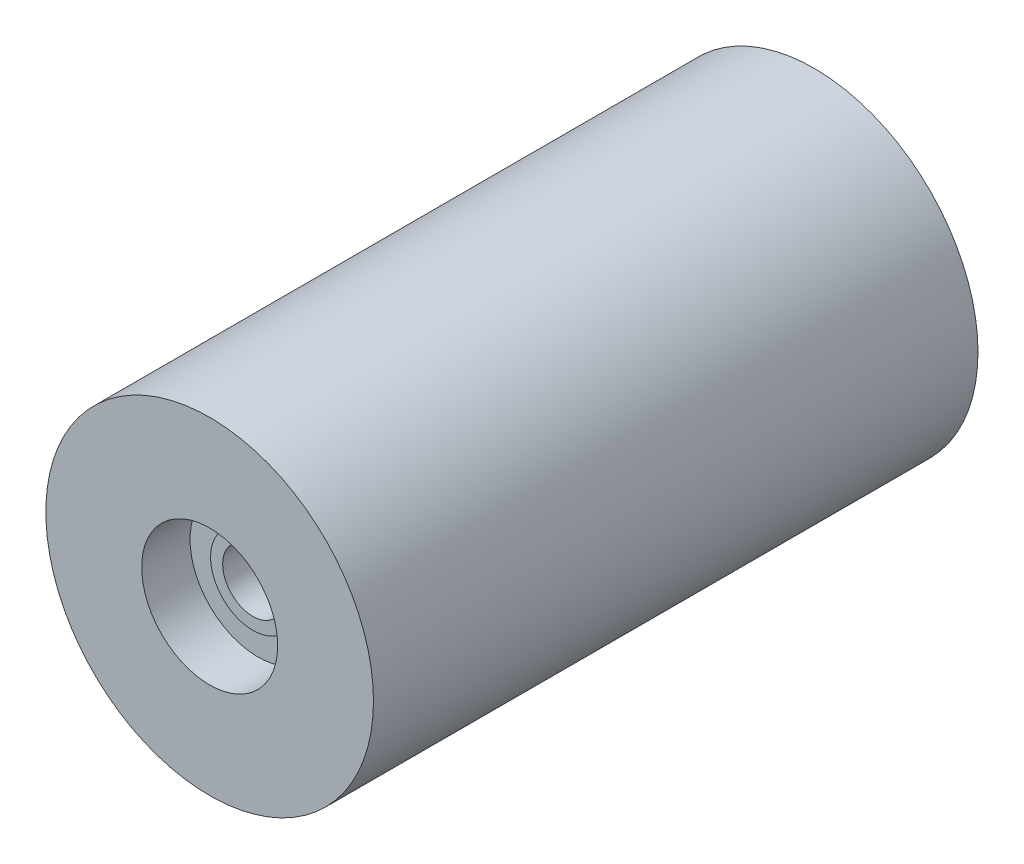
ISO-10303-21;
HEADER;
FILE_DESCRIPTION(('STEP AP214'),'2;1');
FILE_NAME('part.step','',(''),(''),'','','');
FILE_SCHEMA(('AUTOMOTIVE_DESIGN { 1 0 10303 214 1 1 1 1 }'));
ENDSEC;
DATA;
#1=APPLICATION_CONTEXT('core data for automotive mechanical design processes');
#2=APPLICATION_PROTOCOL_DEFINITION('international standard','automotive_design',2000,#1);
#3=PRODUCT_CONTEXT('',#1,'mechanical');
#4=PRODUCT('Part','Part','',(#3));
#5=PRODUCT_RELATED_PRODUCT_CATEGORY('part','',(#4));
#6=PRODUCT_DEFINITION_FORMATION('','',#4);
#7=PRODUCT_DEFINITION_CONTEXT('part definition',#1,'design');
#8=PRODUCT_DEFINITION('design','',#6,#7);
#9=PRODUCT_DEFINITION_SHAPE('','',#8);
#10=(LENGTH_UNIT() NAMED_UNIT(*) SI_UNIT(.MILLI.,.METRE.));
#11=(NAMED_UNIT(*) PLANE_ANGLE_UNIT() SI_UNIT($,.RADIAN.));
#12=(NAMED_UNIT(*) SI_UNIT($,.STERADIAN.) SOLID_ANGLE_UNIT());
#13=UNCERTAINTY_MEASURE_WITH_UNIT(LENGTH_MEASURE(1.E-05),#10,'distance_accuracy_value','');
#14=(GEOMETRIC_REPRESENTATION_CONTEXT(3) GLOBAL_UNCERTAINTY_ASSIGNED_CONTEXT((#13)) GLOBAL_UNIT_ASSIGNED_CONTEXT((#10,
#11,#12)) REPRESENTATION_CONTEXT('',''));
#15=CARTESIAN_POINT('',(0.,0.,0.));
#16=DIRECTION('',(0.,0.,1.));
#17=DIRECTION('',(1.,0.,0.));
#18=AXIS2_PLACEMENT_3D('',#15,#16,#17);
#19=CARTESIAN_POINT('',(0.,0.,100.));
#20=DIRECTION('',(0.,0.,-1.));
#21=DIRECTION('',(-1.,0.,0.));
#22=AXIS2_PLACEMENT_3D('',#19,#20,#21);
#23=CYLINDRICAL_SURFACE('',#22,5.);
#24=CARTESIAN_POINT('',(0.,0.,92.85));
#25=DIRECTION('',(0.,0.,1.));
#26=DIRECTION('',(1.,0.,0.));
#27=AXIS2_PLACEMENT_3D('',#24,#25,#26);
#28=CIRCLE('',#27,5.);
#29=CARTESIAN_POINT('',(5.,0.,92.85));
#30=VERTEX_POINT('',#29);
#31=EDGE_CURVE('E57',#30,#30,#28,.F.);
#32=ORIENTED_EDGE('',*,*,#31,.F.);
#33=EDGE_LOOP('',(#32));
#34=FACE_BOUND('',#33,.T.);
#35=CARTESIAN_POINT('',(0.,0.,7.15));
#36=DIRECTION('',(0.,0.,-1.));
#37=DIRECTION('',(-1.,0.,0.));
#38=AXIS2_PLACEMENT_3D('',#35,#36,#37);
#39=CIRCLE('',#38,5.);
#40=CARTESIAN_POINT('',(-5.,0.,7.15));
#41=VERTEX_POINT('',#40);
#42=EDGE_CURVE('E45',#41,#41,#39,.T.);
#43=ORIENTED_EDGE('',*,*,#42,.T.);
#44=EDGE_LOOP('',(#43));
#45=FACE_BOUND('',#44,.T.);
#46=ADVANCED_FACE('F41',(#34,#45),#23,.F.);
#47=CARTESIAN_POINT('',(0.,0.,100.));
#48=DIRECTION('',(0.,0.,1.));
#49=DIRECTION('',(1.,0.,0.));
#50=AXIS2_PLACEMENT_3D('',#47,#48,#49);
#51=PLANE('',#50);
#52=CARTESIAN_POINT('',(0.,0.,100.));
#53=DIRECTION('',(0.,0.,1.));
#54=DIRECTION('',(1.,0.,0.));
#55=AXIS2_PLACEMENT_3D('',#52,#53,#54);
#56=CIRCLE('',#55,11.25);
#57=CARTESIAN_POINT('',(11.25,0.,100.));
#58=VERTEX_POINT('',#57);
#59=EDGE_CURVE('E67',#58,#58,#56,.T.);
#60=ORIENTED_EDGE('',*,*,#59,.F.);
#61=EDGE_LOOP('',(#60));
#62=FACE_BOUND('',#61,.T.);
#63=CARTESIAN_POINT('',(0.,0.,100.));
#64=DIRECTION('',(0.,0.,1.));
#65=DIRECTION('',(1.,0.,0.));
#66=AXIS2_PLACEMENT_3D('',#63,#64,#65);
#67=CIRCLE('',#66,27.1);
#68=CARTESIAN_POINT('',(27.1,0.,100.));
#69=VERTEX_POINT('',#68);
#70=EDGE_CURVE('E10',#69,#69,#67,.T.);
#71=ORIENTED_EDGE('',*,*,#70,.T.);
#72=EDGE_LOOP('',(#71));
#73=FACE_BOUND('',#72,.T.);
#74=ADVANCED_FACE('F112',(#62,#73),#51,.T.);
#75=CARTESIAN_POINT('',(0.,0.,0.));
#76=DIRECTION('',(0.,0.,1.));
#77=DIRECTION('',(1.,0.,0.));
#78=AXIS2_PLACEMENT_3D('',#75,#76,#77);
#79=PLANE('',#78);
#80=CARTESIAN_POINT('',(0.,0.,0.));
#81=DIRECTION('',(0.,0.,-1.));
#82=DIRECTION('',(-1.,0.,0.));
#83=AXIS2_PLACEMENT_3D('',#80,#81,#82);
#84=CIRCLE('',#83,11.25);
#85=CARTESIAN_POINT('',(-11.25,0.,0.));
#86=VERTEX_POINT('',#85);
#87=EDGE_CURVE('E83',#86,#86,#84,.T.);
#88=ORIENTED_EDGE('',*,*,#87,.F.);
#89=EDGE_LOOP('',(#88));
#90=FACE_BOUND('',#89,.T.);
#91=CARTESIAN_POINT('',(0.,0.,0.));
#92=DIRECTION('',(0.,0.,1.));
#93=DIRECTION('',(1.,0.,0.));
#94=AXIS2_PLACEMENT_3D('',#91,#92,#93);
#95=CIRCLE('',#94,27.1);
#96=CARTESIAN_POINT('',(27.1,0.,0.));
#97=VERTEX_POINT('',#96);
#98=EDGE_CURVE('E50',#97,#97,#95,.T.);
#99=ORIENTED_EDGE('',*,*,#98,.F.);
#100=EDGE_LOOP('',(#99));
#101=FACE_BOUND('',#100,.T.);
#102=ADVANCED_FACE('F109',(#90,#101),#79,.F.);
#103=CARTESIAN_POINT('',(0.,0.,100.));
#104=DIRECTION('',(0.,0.,-1.));
#105=DIRECTION('',(-1.,0.,0.));
#106=AXIS2_PLACEMENT_3D('',#103,#104,#105);
#107=CYLINDRICAL_SURFACE('',#106,27.1);
#108=ORIENTED_EDGE('',*,*,#70,.F.);
#109=EDGE_LOOP('',(#108));
#110=FACE_BOUND('',#109,.T.);
#111=ORIENTED_EDGE('',*,*,#98,.T.);
#112=EDGE_LOOP('',(#111));
#113=FACE_BOUND('',#112,.T.);
#114=ADVANCED_FACE('F43',(#110,#113),#107,.T.);
#115=CARTESIAN_POINT('',(0.,0.,92.85));
#116=DIRECTION('',(0.,0.,1.));
#117=DIRECTION('',(1.,0.,0.));
#118=AXIS2_PLACEMENT_3D('',#115,#116,#117);
#119=PLANE('',#118);
#120=ORIENTED_EDGE('',*,*,#31,.T.);
#121=EDGE_LOOP('',(#120));
#122=FACE_BOUND('',#121,.T.);
#123=CARTESIAN_POINT('',(0.,0.,92.85));
#124=DIRECTION('',(0.,0.,1.));
#125=DIRECTION('',(1.,0.,0.));
#126=AXIS2_PLACEMENT_3D('',#123,#124,#125);
#127=CIRCLE('',#126,7.);
#128=CARTESIAN_POINT('',(7.,0.,92.85));
#129=VERTEX_POINT('',#128);
#130=EDGE_CURVE('E62',#129,#129,#127,.T.);
#131=ORIENTED_EDGE('',*,*,#130,.T.);
#132=EDGE_LOOP('',(#131));
#133=FACE_BOUND('',#132,.T.);
#134=ADVANCED_FACE('F116',(#122,#133),#119,.T.);
#135=CARTESIAN_POINT('',(0.,0.,92.));
#136=DIRECTION('',(0.,0.,1.));
#137=DIRECTION('',(1.,0.,0.));
#138=AXIS2_PLACEMENT_3D('',#135,#136,#137);
#139=CYLINDRICAL_SURFACE('',#138,11.25);
#140=CARTESIAN_POINT('',(0.,0.,92.));
#141=DIRECTION('',(0.,0.,1.));
#142=DIRECTION('',(1.,0.,0.));
#143=AXIS2_PLACEMENT_3D('',#140,#141,#142);
#144=CIRCLE('',#143,11.25);
#145=CARTESIAN_POINT('',(11.25,0.,92.));
#146=VERTEX_POINT('',#145);
#147=EDGE_CURVE('E66',#146,#146,#144,.T.);
#148=ORIENTED_EDGE('',*,*,#147,.F.);
#149=EDGE_LOOP('',(#148));
#150=FACE_BOUND('',#149,.T.);
#151=ORIENTED_EDGE('',*,*,#59,.T.);
#152=EDGE_LOOP('',(#151));
#153=FACE_BOUND('',#152,.T.);
#154=ADVANCED_FACE('F120',(#150,#153),#139,.F.);
#155=CARTESIAN_POINT('',(0.,0.,92.));
#156=DIRECTION('',(0.,0.,1.));
#157=DIRECTION('',(1.,0.,0.));
#158=AXIS2_PLACEMENT_3D('',#155,#156,#157);
#159=PLANE('',#158);
#160=CARTESIAN_POINT('',(0.,0.,92.));
#161=DIRECTION('',(0.,0.,1.));
#162=DIRECTION('',(1.,0.,0.));
#163=AXIS2_PLACEMENT_3D('',#160,#161,#162);
#164=CIRCLE('',#163,7.);
#165=CARTESIAN_POINT('',(7.,0.,92.));
#166=VERTEX_POINT('',#165);
#167=EDGE_CURVE('E71',#166,#166,#164,.T.);
#168=ORIENTED_EDGE('',*,*,#167,.F.);
#169=EDGE_LOOP('',(#168));
#170=FACE_BOUND('',#169,.T.);
#171=ORIENTED_EDGE('',*,*,#147,.T.);
#172=EDGE_LOOP('',(#171));
#173=FACE_BOUND('',#172,.T.);
#174=ADVANCED_FACE('F135',(#170,#173),#159,.T.);
#175=CARTESIAN_POINT('',(0.,0.,92.));
#176=DIRECTION('',(0.,0.,1.));
#177=DIRECTION('',(1.,0.,0.));
#178=AXIS2_PLACEMENT_3D('',#175,#176,#177);
#179=CYLINDRICAL_SURFACE('',#178,7.);
#180=ORIENTED_EDGE('',*,*,#130,.F.);
#181=EDGE_LOOP('',(#180));
#182=FACE_BOUND('',#181,.T.);
#183=ORIENTED_EDGE('',*,*,#167,.T.);
#184=EDGE_LOOP('',(#183));
#185=FACE_BOUND('',#184,.T.);
#186=ADVANCED_FACE('F139',(#182,#185),#179,.T.);
#187=CARTESIAN_POINT('',(0.,0.,7.15));
#188=DIRECTION('',(0.,0.,-1.));
#189=DIRECTION('',(-1.,0.,0.));
#190=AXIS2_PLACEMENT_3D('',#187,#188,#189);
#191=PLANE('',#190);
#192=ORIENTED_EDGE('',*,*,#42,.F.);
#193=EDGE_LOOP('',(#192));
#194=FACE_BOUND('',#193,.T.);
#195=CARTESIAN_POINT('',(0.,0.,7.15));
#196=DIRECTION('',(0.,0.,-1.));
#197=DIRECTION('',(-1.,0.,0.));
#198=AXIS2_PLACEMENT_3D('',#195,#196,#197);
#199=CIRCLE('',#198,7.);
#200=CARTESIAN_POINT('',(-7.,0.,7.15));
#201=VERTEX_POINT('',#200);
#202=EDGE_CURVE('E78',#201,#201,#199,.T.);
#203=ORIENTED_EDGE('',*,*,#202,.T.);
#204=EDGE_LOOP('',(#203));
#205=FACE_BOUND('',#204,.T.);
#206=ADVANCED_FACE('F105',(#194,#205),#191,.T.);
#207=CARTESIAN_POINT('',(0.,0.,8.));
#208=DIRECTION('',(0.,0.,-1.));
#209=DIRECTION('',(-1.,0.,0.));
#210=AXIS2_PLACEMENT_3D('',#207,#208,#209);
#211=CYLINDRICAL_SURFACE('',#210,11.25);
#212=CARTESIAN_POINT('',(0.,0.,8.));
#213=DIRECTION('',(0.,0.,-1.));
#214=DIRECTION('',(-1.,0.,0.));
#215=AXIS2_PLACEMENT_3D('',#212,#213,#214);
#216=CIRCLE('',#215,11.25);
#217=CARTESIAN_POINT('',(-11.25,0.,8.));
#218=VERTEX_POINT('',#217);
#219=EDGE_CURVE('E82',#218,#218,#216,.T.);
#220=ORIENTED_EDGE('',*,*,#219,.F.);
#221=EDGE_LOOP('',(#220));
#222=FACE_BOUND('',#221,.T.);
#223=ORIENTED_EDGE('',*,*,#87,.T.);
#224=EDGE_LOOP('',(#223));
#225=FACE_BOUND('',#224,.T.);
#226=ADVANCED_FACE('F99',(#222,#225),#211,.F.);
#227=CARTESIAN_POINT('',(0.,0.,8.));
#228=DIRECTION('',(0.,0.,-1.));
#229=DIRECTION('',(-1.,0.,0.));
#230=AXIS2_PLACEMENT_3D('',#227,#228,#229);
#231=PLANE('',#230);
#232=CARTESIAN_POINT('',(0.,0.,8.));
#233=DIRECTION('',(0.,0.,-1.));
#234=DIRECTION('',(-1.,0.,0.));
#235=AXIS2_PLACEMENT_3D('',#232,#233,#234);
#236=CIRCLE('',#235,7.);
#237=CARTESIAN_POINT('',(-7.,0.,8.));
#238=VERTEX_POINT('',#237);
#239=EDGE_CURVE('E87',#238,#238,#236,.T.);
#240=ORIENTED_EDGE('',*,*,#239,.F.);
#241=EDGE_LOOP('',(#240));
#242=FACE_BOUND('',#241,.T.);
#243=ORIENTED_EDGE('',*,*,#219,.T.);
#244=EDGE_LOOP('',(#243));
#245=FACE_BOUND('',#244,.T.);
#246=ADVANCED_FACE('F96',(#242,#245),#231,.T.);
#247=CARTESIAN_POINT('',(0.,0.,8.));
#248=DIRECTION('',(0.,0.,-1.));
#249=DIRECTION('',(-1.,0.,0.));
#250=AXIS2_PLACEMENT_3D('',#247,#248,#249);
#251=CYLINDRICAL_SURFACE('',#250,7.);
#252=ORIENTED_EDGE('',*,*,#202,.F.);
#253=EDGE_LOOP('',(#252));
#254=FACE_BOUND('',#253,.T.);
#255=ORIENTED_EDGE('',*,*,#239,.T.);
#256=EDGE_LOOP('',(#255));
#257=FACE_BOUND('',#256,.T.);
#258=ADVANCED_FACE('F94',(#254,#257),#251,.T.);
#259=CLOSED_SHELL('',(#46,#74,#102,#114,#134,#154,#174,#186,#206,#226,#246,#258));
#260=MANIFOLD_SOLID_BREP('B2',#259);
#261=ADVANCED_BREP_SHAPE_REPRESENTATION('',(#18,#260),#14);
#262=SHAPE_DEFINITION_REPRESENTATION(#9,#261);
ENDSEC;
END-ISO-10303-21;
